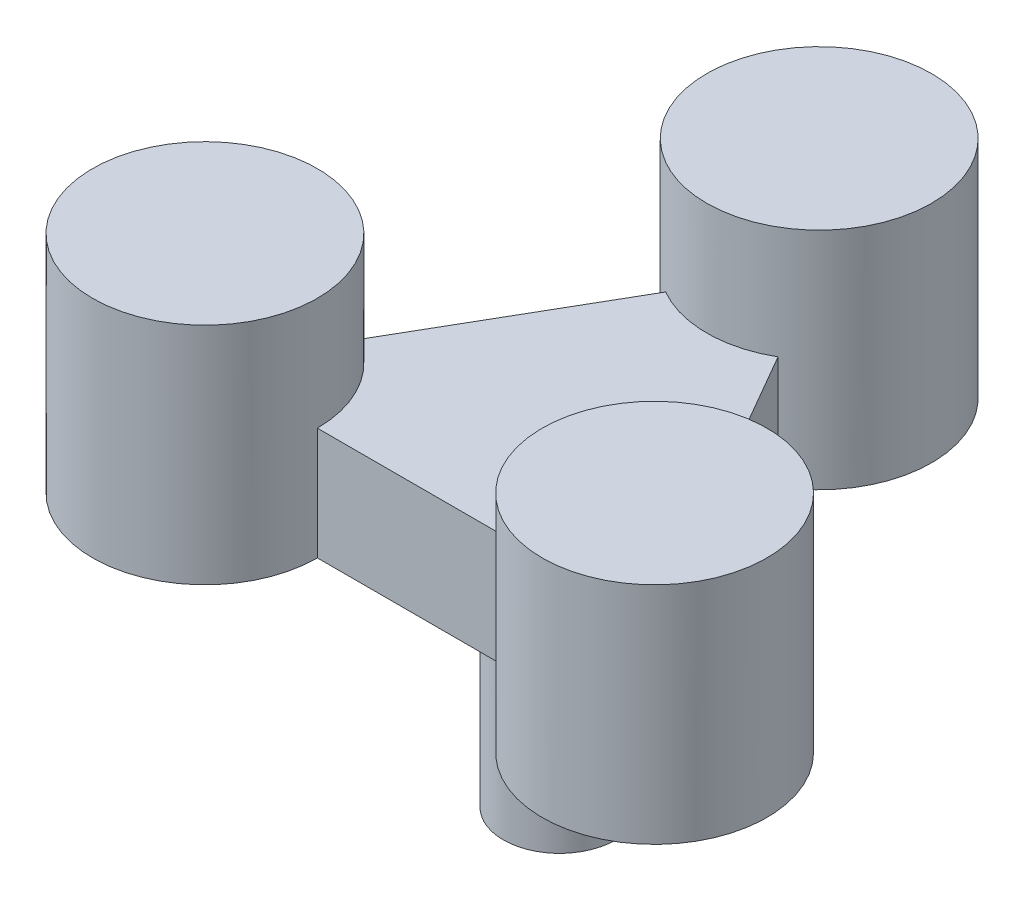
ISO-10303-21;
HEADER;
FILE_DESCRIPTION(('STEP AP214'),'2;1');
FILE_NAME('part.step','',(''),(''),'','','');
FILE_SCHEMA(('AUTOMOTIVE_DESIGN { 1 0 10303 214 1 1 1 1 }'));
ENDSEC;
DATA;
#1=APPLICATION_CONTEXT('core data for automotive mechanical design processes');
#2=APPLICATION_PROTOCOL_DEFINITION('international standard','automotive_design',2000,#1);
#3=PRODUCT_CONTEXT('',#1,'mechanical');
#4=PRODUCT('Part','Part','',(#3));
#5=PRODUCT_RELATED_PRODUCT_CATEGORY('part','',(#4));
#6=PRODUCT_DEFINITION_FORMATION('','',#4);
#7=PRODUCT_DEFINITION_CONTEXT('part definition',#1,'design');
#8=PRODUCT_DEFINITION('design','',#6,#7);
#9=PRODUCT_DEFINITION_SHAPE('','',#8);
#10=(LENGTH_UNIT() NAMED_UNIT(*) SI_UNIT(.MILLI.,.METRE.));
#11=(NAMED_UNIT(*) PLANE_ANGLE_UNIT() SI_UNIT($,.RADIAN.));
#12=(NAMED_UNIT(*) SI_UNIT($,.STERADIAN.) SOLID_ANGLE_UNIT());
#13=UNCERTAINTY_MEASURE_WITH_UNIT(LENGTH_MEASURE(1.E-05),#10,'distance_accuracy_value','');
#14=(GEOMETRIC_REPRESENTATION_CONTEXT(3) GLOBAL_UNCERTAINTY_ASSIGNED_CONTEXT((#13)) GLOBAL_UNIT_ASSIGNED_CONTEXT((#10,
#11,#12)) REPRESENTATION_CONTEXT('',''));
#15=CARTESIAN_POINT('',(0.,0.,0.));
#16=DIRECTION('',(0.,0.,1.));
#17=DIRECTION('',(1.,0.,0.));
#18=AXIS2_PLACEMENT_3D('',#15,#16,#17);
#19=CARTESIAN_POINT('',(-25.4000000000002,12.7,14.6646968374162));
#20=DIRECTION('',(0.,1.,0.));
#21=DIRECTION('',(0.,0.,1.));
#22=AXIS2_PLACEMENT_3D('',#19,#20,#21);
#23=PLANE('',#22);
#24=DIRECTION('',(-0.500000000000003,0.,-0.866025403784437));
#25=VECTOR('',#24,1.);
#26=CARTESIAN_POINT('',(19.0499999999996,12.7,3.66617420935396));
#27=LINE('',#26,#25);
#28=CARTESIAN_POINT('',(19.0499999999996,12.7,3.66617420935391));
#29=VERTEX_POINT('',#28);
#30=CARTESIAN_POINT('',(6.3499999999999,12.7,-18.3308710467702));
#31=VERTEX_POINT('',#30);
#32=EDGE_CURVE('E98',#29,#31,#27,.T.);
#33=ORIENTED_EDGE('',*,*,#32,.T.);
#34=CARTESIAN_POINT('',(0.,12.7,-29.3293936748326));
#35=DIRECTION('',(0.,1.,0.));
#36=DIRECTION('',(0.,0.,1.));
#37=AXIS2_PLACEMENT_3D('',#34,#35,#36);
#38=CIRCLE('',#37,12.7);
#39=CARTESIAN_POINT('',(-6.35000000000016,12.7,-18.3308710467703));
#40=VERTEX_POINT('',#39);
#41=EDGE_CURVE('E103',#40,#31,#38,.T.);
#42=ORIENTED_EDGE('',*,*,#41,.F.);
#43=DIRECTION('',(-0.500000000000009,0.,0.866025403784433));
#44=VECTOR('',#43,1.);
#45=CARTESIAN_POINT('',(-6.35000000000015,12.7,-18.3308710467703));
#46=LINE('',#45,#44);
#47=CARTESIAN_POINT('',(-19.0500000000001,12.7,3.66617420935384));
#48=VERTEX_POINT('',#47);
#49=EDGE_CURVE('E50',#40,#48,#46,.T.);
#50=ORIENTED_EDGE('',*,*,#49,.T.);
#51=CARTESIAN_POINT('',(-25.4000000000002,12.7,14.6646968374162));
#52=DIRECTION('',(0.,1.,0.));
#53=DIRECTION('',(0.,0.,1.));
#54=AXIS2_PLACEMENT_3D('',#51,#52,#53);
#55=CIRCLE('',#54,12.7);
#56=CARTESIAN_POINT('',(-12.7000000000003,12.7,14.6646968374162));
#57=VERTEX_POINT('',#56);
#58=EDGE_CURVE('E119',#57,#48,#55,.T.);
#59=ORIENTED_EDGE('',*,*,#58,.F.);
#60=DIRECTION('',(1.,0.,0.));
#61=VECTOR('',#60,1.);
#62=CARTESIAN_POINT('',(-12.7000000000003,12.7,14.6646968374162));
#63=LINE('',#62,#61);
#64=CARTESIAN_POINT('',(12.6999999999998,12.7,14.6646968374162));
#65=VERTEX_POINT('',#64);
#66=EDGE_CURVE('E85',#57,#65,#63,.T.);
#67=ORIENTED_EDGE('',*,*,#66,.T.);
#68=CARTESIAN_POINT('',(25.3999999999998,12.7,14.6646968374162));
#69=DIRECTION('',(0.,1.,0.));
#70=DIRECTION('',(0.,0.,1.));
#71=AXIS2_PLACEMENT_3D('',#68,#69,#70);
#72=CIRCLE('',#71,12.7);
#73=EDGE_CURVE('E111',#29,#65,#72,.T.);
#74=ORIENTED_EDGE('',*,*,#73,.F.);
#75=EDGE_LOOP('',(#33,#42,#50,#59,#67,#74));
#76=FACE_BOUND('',#75,.T.);
#77=ADVANCED_FACE('F33',(#76),#23,.T.);
#78=CARTESIAN_POINT('',(-25.4000000000002,12.7,14.6646968374162));
#79=DIRECTION('',(0.,-1.,0.));
#80=DIRECTION('',(0.,0.,-1.));
#81=AXIS2_PLACEMENT_3D('',#78,#79,#80);
#82=CYLINDRICAL_SURFACE('',#81,12.7);
#83=CARTESIAN_POINT('',(-25.4000000000002,0.,14.6646968374162));
#84=DIRECTION('',(0.,1.,0.));
#85=DIRECTION('',(0.,0.,1.));
#86=AXIS2_PLACEMENT_3D('',#83,#84,#85);
#87=CIRCLE('',#86,12.7);
#88=CARTESIAN_POINT('',(-19.0500000000001,0.,3.66617420935384));
#89=VERTEX_POINT('',#88);
#90=CARTESIAN_POINT('',(-12.7000000000003,0.,14.6646968374162));
#91=VERTEX_POINT('',#90);
#92=EDGE_CURVE('E125',#89,#91,#87,.T.);
#93=ORIENTED_EDGE('',*,*,#92,.T.);
#94=DIRECTION('',(0.,-1.,0.));
#95=VECTOR('',#94,1.);
#96=CARTESIAN_POINT('',(-12.7000000000003,12.7,14.6646968374162));
#97=LINE('',#96,#95);
#98=EDGE_CURVE('E42',#57,#91,#97,.T.);
#99=ORIENTED_EDGE('',*,*,#98,.F.);
#100=ORIENTED_EDGE('',*,*,#58,.T.);
#101=DIRECTION('',(0.,-1.,0.));
#102=VECTOR('',#101,1.);
#103=CARTESIAN_POINT('',(-19.0500000000001,12.7,3.66617420935384));
#104=LINE('',#103,#102);
#105=EDGE_CURVE('E96',#48,#89,#104,.T.);
#106=ORIENTED_EDGE('',*,*,#105,.T.);
#107=EDGE_LOOP('',(#93,#99,#100,#106));
#108=FACE_BOUND('',#107,.T.);
#109=CARTESIAN_POINT('',(-25.4000000000002,25.4,14.6646968374162));
#110=DIRECTION('',(0.,1.,0.));
#111=DIRECTION('',(0.,0.,1.));
#112=AXIS2_PLACEMENT_3D('',#109,#110,#111);
#113=CIRCLE('',#112,12.7);
#114=CARTESIAN_POINT('',(-25.4000000000002,25.4,27.3646968374161));
#115=VERTEX_POINT('',#114);
#116=EDGE_CURVE('E122',#115,#115,#113,.T.);
#117=ORIENTED_EDGE('',*,*,#116,.F.);
#118=EDGE_LOOP('',(#117));
#119=FACE_BOUND('',#118,.T.);
#120=ADVANCED_FACE('F35',(#108,#119),#82,.T.);
#121=CARTESIAN_POINT('',(-12.7000000000003,12.7,14.6646968374162));
#122=DIRECTION('',(0.,0.,-1.));
#123=DIRECTION('',(-1.,0.,0.));
#124=AXIS2_PLACEMENT_3D('',#121,#122,#123);
#125=PLANE('',#124);
#126=DIRECTION('',(1.,0.,0.));
#127=VECTOR('',#126,1.);
#128=CARTESIAN_POINT('',(-12.7000000000003,0.,14.6646968374162));
#129=LINE('',#128,#127);
#130=CARTESIAN_POINT('',(12.6999999999998,0.,14.6646968374162));
#131=VERTEX_POINT('',#130);
#132=EDGE_CURVE('E131',#91,#131,#129,.T.);
#133=ORIENTED_EDGE('',*,*,#132,.T.);
#134=DIRECTION('',(0.,-1.,0.));
#135=VECTOR('',#134,1.);
#136=CARTESIAN_POINT('',(12.6999999999998,12.7,14.6646968374162));
#137=LINE('',#136,#135);
#138=EDGE_CURVE('E144',#65,#131,#137,.T.);
#139=ORIENTED_EDGE('',*,*,#138,.F.);
#140=ORIENTED_EDGE('',*,*,#66,.F.);
#141=ORIENTED_EDGE('',*,*,#98,.T.);
#142=EDGE_LOOP('',(#133,#139,#140,#141));
#143=FACE_BOUND('',#142,.T.);
#144=ADVANCED_FACE('F148',(#143),#125,.F.);
#145=CARTESIAN_POINT('',(25.3999999999998,12.7,14.6646968374162));
#146=DIRECTION('',(0.,-1.,0.));
#147=DIRECTION('',(0.,0.,-1.));
#148=AXIS2_PLACEMENT_3D('',#145,#146,#147);
#149=CYLINDRICAL_SURFACE('',#148,12.7);
#150=CARTESIAN_POINT('',(25.3999999999998,0.,14.6646968374162));
#151=DIRECTION('',(0.,1.,0.));
#152=DIRECTION('',(0.,0.,1.));
#153=AXIS2_PLACEMENT_3D('',#150,#151,#152);
#154=CIRCLE('',#153,12.7);
#155=CARTESIAN_POINT('',(19.0499999999996,0.,3.66617420935392));
#156=VERTEX_POINT('',#155);
#157=EDGE_CURVE('E133',#131,#156,#154,.T.);
#158=ORIENTED_EDGE('',*,*,#157,.T.);
#159=DIRECTION('',(0.,-1.,0.));
#160=VECTOR('',#159,1.);
#161=CARTESIAN_POINT('',(19.0499999999996,12.7,3.66617420935392));
#162=LINE('',#161,#160);
#163=EDGE_CURVE('E141',#29,#156,#162,.T.);
#164=ORIENTED_EDGE('',*,*,#163,.F.);
#165=ORIENTED_EDGE('',*,*,#73,.T.);
#166=ORIENTED_EDGE('',*,*,#138,.T.);
#167=EDGE_LOOP('',(#158,#164,#165,#166));
#168=FACE_BOUND('',#167,.T.);
#169=CARTESIAN_POINT('',(25.3999999999998,25.4,14.6646968374162));
#170=DIRECTION('',(0.,1.,0.));
#171=DIRECTION('',(0.,0.,1.));
#172=AXIS2_PLACEMENT_3D('',#169,#170,#171);
#173=CIRCLE('',#172,12.7);
#174=CARTESIAN_POINT('',(25.3999999999998,25.4,27.3646968374161));
#175=VERTEX_POINT('',#174);
#176=EDGE_CURVE('E116',#175,#175,#173,.T.);
#177=ORIENTED_EDGE('',*,*,#176,.F.);
#178=EDGE_LOOP('',(#177));
#179=FACE_BOUND('',#178,.T.);
#180=ADVANCED_FACE('F158',(#168,#179),#149,.T.);
#181=CARTESIAN_POINT('',(19.0499999999996,12.7,3.66617420935396));
#182=DIRECTION('',(-0.866025403784437,0.,0.500000000000003));
#183=DIRECTION('',(0.500000000000003,0.,0.866025403784437));
#184=AXIS2_PLACEMENT_3D('',#181,#182,#183);
#185=PLANE('',#184);
#186=DIRECTION('',(-0.500000000000003,0.,-0.866025403784437));
#187=VECTOR('',#186,1.);
#188=CARTESIAN_POINT('',(19.0499999999996,0.,3.66617420935396));
#189=LINE('',#188,#187);
#190=CARTESIAN_POINT('',(6.3499999999999,0.,-18.3308710467702));
#191=VERTEX_POINT('',#190);
#192=EDGE_CURVE('E135',#156,#191,#189,.T.);
#193=ORIENTED_EDGE('',*,*,#192,.T.);
#194=DIRECTION('',(0.,-1.,0.));
#195=VECTOR('',#194,1.);
#196=CARTESIAN_POINT('',(6.3499999999999,12.7,-18.3308710467702));
#197=LINE('',#196,#195);
#198=EDGE_CURVE('E104',#31,#191,#197,.T.);
#199=ORIENTED_EDGE('',*,*,#198,.F.);
#200=ORIENTED_EDGE('',*,*,#32,.F.);
#201=ORIENTED_EDGE('',*,*,#163,.T.);
#202=EDGE_LOOP('',(#193,#199,#200,#201));
#203=FACE_BOUND('',#202,.T.);
#204=ADVANCED_FACE('F161',(#203),#185,.F.);
#205=CARTESIAN_POINT('',(0.,12.7,-29.3293936748326));
#206=DIRECTION('',(0.,-1.,0.));
#207=DIRECTION('',(0.,0.,-1.));
#208=AXIS2_PLACEMENT_3D('',#205,#206,#207);
#209=CYLINDRICAL_SURFACE('',#208,12.7);
#210=CARTESIAN_POINT('',(0.,0.,-29.3293936748326));
#211=DIRECTION('',(0.,1.,0.));
#212=DIRECTION('',(0.,0.,1.));
#213=AXIS2_PLACEMENT_3D('',#210,#211,#212);
#214=CIRCLE('',#213,12.7);
#215=CARTESIAN_POINT('',(-6.35000000000015,0.,-18.3308710467703));
#216=VERTEX_POINT('',#215);
#217=EDGE_CURVE('E75',#191,#216,#214,.T.);
#218=ORIENTED_EDGE('',*,*,#217,.T.);
#219=DIRECTION('',(0.,-1.,0.));
#220=VECTOR('',#219,1.);
#221=CARTESIAN_POINT('',(-6.35000000000015,12.7,-18.3308710467703));
#222=LINE('',#221,#220);
#223=EDGE_CURVE('E95',#40,#216,#222,.T.);
#224=ORIENTED_EDGE('',*,*,#223,.F.);
#225=ORIENTED_EDGE('',*,*,#41,.T.);
#226=ORIENTED_EDGE('',*,*,#198,.T.);
#227=EDGE_LOOP('',(#218,#224,#225,#226));
#228=FACE_BOUND('',#227,.T.);
#229=CARTESIAN_POINT('',(0.,25.4,-29.3293936748326));
#230=DIRECTION('',(0.,1.,0.));
#231=DIRECTION('',(0.,0.,1.));
#232=AXIS2_PLACEMENT_3D('',#229,#230,#231);
#233=CIRCLE('',#232,12.7);
#234=CARTESIAN_POINT('',(0.,25.4,-16.6293936748326));
#235=VERTEX_POINT('',#234);
#236=EDGE_CURVE('E107',#235,#235,#233,.T.);
#237=ORIENTED_EDGE('',*,*,#236,.F.);
#238=EDGE_LOOP('',(#237));
#239=FACE_BOUND('',#238,.T.);
#240=ADVANCED_FACE('F101',(#228,#239),#209,.T.);
#241=CARTESIAN_POINT('',(-6.35000000000015,12.7,-18.3308710467703));
#242=DIRECTION('',(0.866025403784433,0.,0.500000000000009));
#243=DIRECTION('',(0.500000000000009,0.,-0.866025403784433));
#244=AXIS2_PLACEMENT_3D('',#241,#242,#243);
#245=PLANE('',#244);
#246=DIRECTION('',(-0.500000000000009,0.,0.866025403784433));
#247=VECTOR('',#246,1.);
#248=CARTESIAN_POINT('',(-6.35000000000015,0.,-18.3308710467703));
#249=LINE('',#248,#247);
#250=EDGE_CURVE('E80',#216,#89,#249,.T.);
#251=ORIENTED_EDGE('',*,*,#250,.T.);
#252=ORIENTED_EDGE('',*,*,#105,.F.);
#253=ORIENTED_EDGE('',*,*,#49,.F.);
#254=ORIENTED_EDGE('',*,*,#223,.T.);
#255=EDGE_LOOP('',(#251,#252,#253,#254));
#256=FACE_BOUND('',#255,.T.);
#257=ADVANCED_FACE('F94',(#256),#245,.F.);
#258=CARTESIAN_POINT('',(-25.4000000000002,0.,14.6646968374162));
#259=DIRECTION('',(0.,1.,0.));
#260=DIRECTION('',(0.,0.,1.));
#261=AXIS2_PLACEMENT_3D('',#258,#259,#260);
#262=PLANE('',#261);
#263=CARTESIAN_POINT('',(0.,0.,0.));
#264=DIRECTION('',(0.,1.,0.));
#265=DIRECTION('',(0.,0.,1.));
#266=AXIS2_PLACEMENT_3D('',#263,#264,#265);
#267=CIRCLE('',#266,6.35);
#268=CARTESIAN_POINT('',(0.,0.,6.35));
#269=VERTEX_POINT('',#268);
#270=EDGE_CURVE('E11',#269,#269,#267,.F.);
#271=ORIENTED_EDGE('',*,*,#270,.F.);
#272=EDGE_LOOP('',(#271));
#273=FACE_BOUND('',#272,.T.);
#274=ORIENTED_EDGE('',*,*,#92,.F.);
#275=ORIENTED_EDGE('',*,*,#250,.F.);
#276=ORIENTED_EDGE('',*,*,#217,.F.);
#277=ORIENTED_EDGE('',*,*,#192,.F.);
#278=ORIENTED_EDGE('',*,*,#157,.F.);
#279=ORIENTED_EDGE('',*,*,#132,.F.);
#280=EDGE_LOOP('',(#274,#275,#276,#277,#278,#279));
#281=FACE_BOUND('',#280,.T.);
#282=ADVANCED_FACE('F153',(#273,#281),#262,.F.);
#283=CARTESIAN_POINT('',(-25.4000000000002,25.4,14.6646968374162));
#284=DIRECTION('',(0.,1.,0.));
#285=DIRECTION('',(0.,0.,1.));
#286=AXIS2_PLACEMENT_3D('',#283,#284,#285);
#287=PLANE('',#286);
#288=ORIENTED_EDGE('',*,*,#116,.T.);
#289=EDGE_LOOP('',(#288));
#290=FACE_BOUND('',#289,.T.);
#291=ADVANCED_FACE('F177',(#290),#287,.T.);
#292=CARTESIAN_POINT('',(25.3999999999998,25.4,14.6646968374162));
#293=DIRECTION('',(0.,1.,0.));
#294=DIRECTION('',(0.,0.,1.));
#295=AXIS2_PLACEMENT_3D('',#292,#293,#294);
#296=PLANE('',#295);
#297=ORIENTED_EDGE('',*,*,#176,.T.);
#298=EDGE_LOOP('',(#297));
#299=FACE_BOUND('',#298,.T.);
#300=ADVANCED_FACE('F199',(#299),#296,.T.);
#301=CARTESIAN_POINT('',(0.,25.4,-29.3293936748326));
#302=DIRECTION('',(0.,1.,0.));
#303=DIRECTION('',(0.,0.,1.));
#304=AXIS2_PLACEMENT_3D('',#301,#302,#303);
#305=PLANE('',#304);
#306=ORIENTED_EDGE('',*,*,#236,.T.);
#307=EDGE_LOOP('',(#306));
#308=FACE_BOUND('',#307,.T.);
#309=ADVANCED_FACE('F206',(#308),#305,.T.);
#310=CARTESIAN_POINT('',(0.,-25.4,0.));
#311=DIRECTION('',(0.,1.,0.));
#312=DIRECTION('',(0.,0.,1.));
#313=AXIS2_PLACEMENT_3D('',#310,#311,#312);
#314=CYLINDRICAL_SURFACE('',#313,6.35);
#315=CARTESIAN_POINT('',(0.,-25.4,0.));
#316=DIRECTION('',(0.,-1.,0.));
#317=DIRECTION('',(0.,0.,-1.));
#318=AXIS2_PLACEMENT_3D('',#315,#316,#317);
#319=CIRCLE('',#318,6.35);
#320=CARTESIAN_POINT('',(0.,-25.4,-6.35));
#321=VERTEX_POINT('',#320);
#322=EDGE_CURVE('E108',#321,#321,#319,.T.);
#323=ORIENTED_EDGE('',*,*,#322,.F.);
#324=EDGE_LOOP('',(#323));
#325=FACE_BOUND('',#324,.T.);
#326=ORIENTED_EDGE('',*,*,#270,.T.);
#327=EDGE_LOOP('',(#326));
#328=FACE_BOUND('',#327,.T.);
#329=ADVANCED_FACE('F212',(#325,#328),#314,.T.);
#330=CARTESIAN_POINT('',(0.,-25.4,0.));
#331=DIRECTION('',(0.,-1.,0.));
#332=DIRECTION('',(0.,0.,-1.));
#333=AXIS2_PLACEMENT_3D('',#330,#331,#332);
#334=PLANE('',#333);
#335=ORIENTED_EDGE('',*,*,#322,.T.);
#336=EDGE_LOOP('',(#335));
#337=FACE_BOUND('',#336,.T.);
#338=ADVANCED_FACE('F219',(#337),#334,.T.);
#339=CLOSED_SHELL('',(#77,#120,#144,#180,#204,#240,#257,#282,#291,#300,#309,#329,#338));
#340=MANIFOLD_SOLID_BREP('B2',#339);
#341=ADVANCED_BREP_SHAPE_REPRESENTATION('',(#18,#340),#14);
#342=SHAPE_DEFINITION_REPRESENTATION(#9,#341);
ENDSEC;
END-ISO-10303-21;
